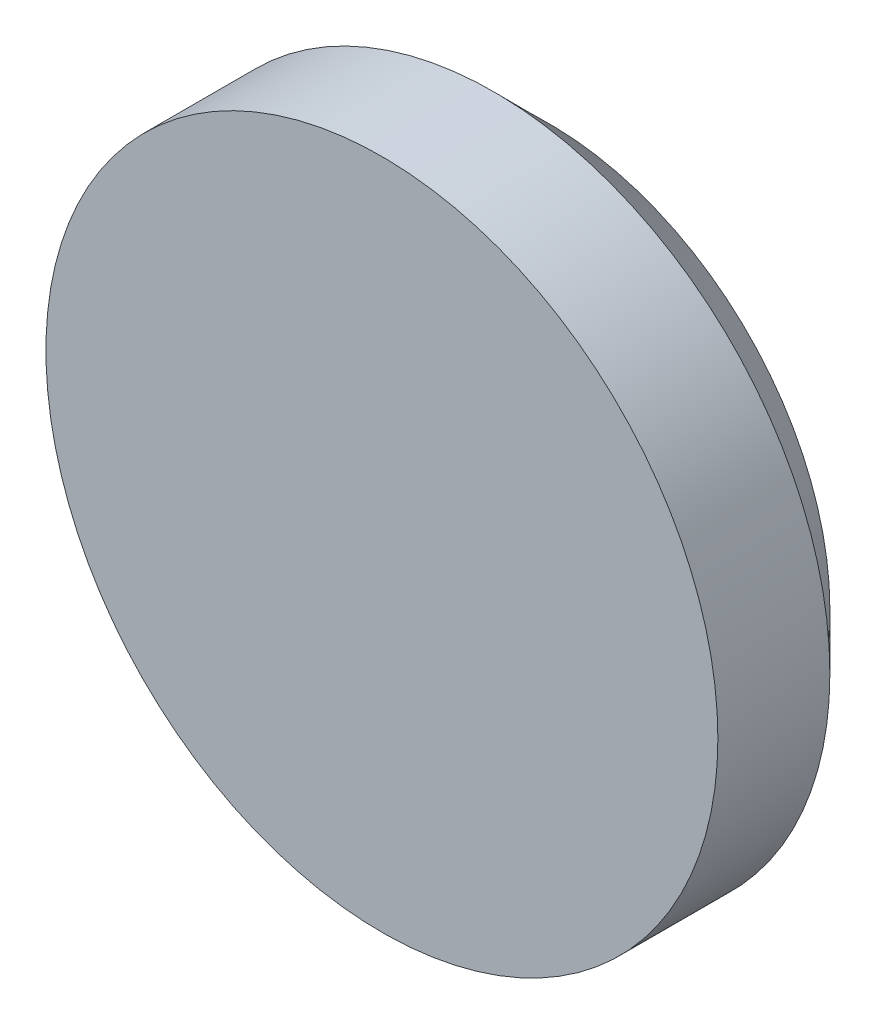
ISO-10303-21;
HEADER;
FILE_DESCRIPTION(('STEP AP214'),'2;1');
FILE_NAME('part.step','',(''),(''),'','','');
FILE_SCHEMA(('AUTOMOTIVE_DESIGN { 1 0 10303 214 1 1 1 1 }'));
ENDSEC;
DATA;
#1=APPLICATION_CONTEXT('core data for automotive mechanical design processes');
#2=APPLICATION_PROTOCOL_DEFINITION('international standard','automotive_design',2000,#1);
#3=PRODUCT_CONTEXT('',#1,'mechanical');
#4=PRODUCT('Part','Part','',(#3));
#5=PRODUCT_RELATED_PRODUCT_CATEGORY('part','',(#4));
#6=PRODUCT_DEFINITION_FORMATION('','',#4);
#7=PRODUCT_DEFINITION_CONTEXT('part definition',#1,'design');
#8=PRODUCT_DEFINITION('design','',#6,#7);
#9=PRODUCT_DEFINITION_SHAPE('','',#8);
#10=(LENGTH_UNIT() NAMED_UNIT(*) SI_UNIT(.MILLI.,.METRE.));
#11=(NAMED_UNIT(*) PLANE_ANGLE_UNIT() SI_UNIT($,.RADIAN.));
#12=(NAMED_UNIT(*) SI_UNIT($,.STERADIAN.) SOLID_ANGLE_UNIT());
#13=UNCERTAINTY_MEASURE_WITH_UNIT(LENGTH_MEASURE(1.E-05),#10,'distance_accuracy_value','');
#14=(GEOMETRIC_REPRESENTATION_CONTEXT(3) GLOBAL_UNCERTAINTY_ASSIGNED_CONTEXT((#13)) GLOBAL_UNIT_ASSIGNED_CONTEXT((#10,
#11,#12)) REPRESENTATION_CONTEXT('',''));
#15=CARTESIAN_POINT('',(0.,0.,0.));
#16=DIRECTION('',(0.,0.,1.));
#17=DIRECTION('',(1.,0.,0.));
#18=AXIS2_PLACEMENT_3D('',#15,#16,#17);
#19=CARTESIAN_POINT('',(0.,0.,-52.5));
#20=DIRECTION('',(0.,0.,-1.));
#21=DIRECTION('',(-1.,0.,0.));
#22=AXIS2_PLACEMENT_3D('',#19,#20,#21);
#23=PLANE('',#22);
#24=CARTESIAN_POINT('',(0.,0.,-52.4999999999523));
#25=DIRECTION('',(0.,0.,1.));
#26=DIRECTION('',(1.,0.,0.));
#27=AXIS2_PLACEMENT_3D('',#24,#25,#26);
#28=CIRCLE('',#27,2.49999999999773);
#29=CARTESIAN_POINT('',(2.49999999999773,0.,-52.4999999999523));
#30=VERTEX_POINT('',#29);
#31=EDGE_CURVE('E18',#30,#30,#28,.T.);
#32=ORIENTED_EDGE('',*,*,#31,.F.);
#33=EDGE_LOOP('',(#32));
#34=FACE_BOUND('',#33,.T.);
#35=ADVANCED_FACE('F15',(#34),#23,.T.);
#36=CARTESIAN_POINT('',(0.,0.,-52.0000000000778));
#37=DIRECTION('',(0.,0.,1.));
#38=DIRECTION('',(1.,0.,0.));
#39=AXIS2_PLACEMENT_3D('',#36,#37,#38);
#40=CONICAL_SURFACE('',#39,2.99999999992906,0.785398163454292);
#41=CARTESIAN_POINT('',(0.,0.,-52.));
#42=DIRECTION('',(0.,0.,1.));
#43=DIRECTION('',(1.,0.,0.));
#44=AXIS2_PLACEMENT_3D('',#41,#42,#43);
#45=CIRCLE('',#44,3.);
#46=CARTESIAN_POINT('',(3.,0.,-52.));
#47=VERTEX_POINT('',#46);
#48=EDGE_CURVE('E22',#47,#47,#45,.T.);
#49=ORIENTED_EDGE('',*,*,#48,.F.);
#50=EDGE_LOOP('',(#49));
#51=FACE_BOUND('',#50,.T.);
#52=ORIENTED_EDGE('',*,*,#31,.T.);
#53=EDGE_LOOP('',(#52));
#54=FACE_BOUND('',#53,.T.);
#55=ADVANCED_FACE('F32',(#51,#54),#40,.T.);
#56=CARTESIAN_POINT('',(0.,0.,-52.5));
#57=DIRECTION('',(0.,0.,1.));
#58=DIRECTION('',(1.,0.,0.));
#59=AXIS2_PLACEMENT_3D('',#56,#57,#58);
#60=CYLINDRICAL_SURFACE('',#59,3.);
#61=CARTESIAN_POINT('',(0.,0.,-51.));
#62=DIRECTION('',(0.,0.,1.));
#63=DIRECTION('',(1.,0.,0.));
#64=AXIS2_PLACEMENT_3D('',#61,#62,#63);
#65=CIRCLE('',#64,3.);
#66=CARTESIAN_POINT('',(3.,0.,-51.));
#67=VERTEX_POINT('',#66);
#68=EDGE_CURVE('E10',#67,#67,#65,.F.);
#69=ORIENTED_EDGE('',*,*,#68,.T.);
#70=EDGE_LOOP('',(#69));
#71=FACE_BOUND('',#70,.T.);
#72=ORIENTED_EDGE('',*,*,#48,.T.);
#73=EDGE_LOOP('',(#72));
#74=FACE_BOUND('',#73,.T.);
#75=ADVANCED_FACE('F39',(#71,#74),#60,.T.);
#76=CARTESIAN_POINT('',(0.,0.,-51.));
#77=DIRECTION('',(0.,0.,-1.));
#78=DIRECTION('',(-1.,0.,0.));
#79=AXIS2_PLACEMENT_3D('',#76,#77,#78);
#80=PLANE('',#79);
#81=ORIENTED_EDGE('',*,*,#68,.F.);
#82=EDGE_LOOP('',(#81));
#83=FACE_BOUND('',#82,.T.);
#84=ADVANCED_FACE('F41',(#83),#80,.F.);
#85=CLOSED_SHELL('',(#35,#55,#75,#84));
#86=MANIFOLD_SOLID_BREP('B1',#85);
#87=ADVANCED_BREP_SHAPE_REPRESENTATION('',(#18,#86),#14);
#88=SHAPE_DEFINITION_REPRESENTATION(#9,#87);
ENDSEC;
END-ISO-10303-21;
